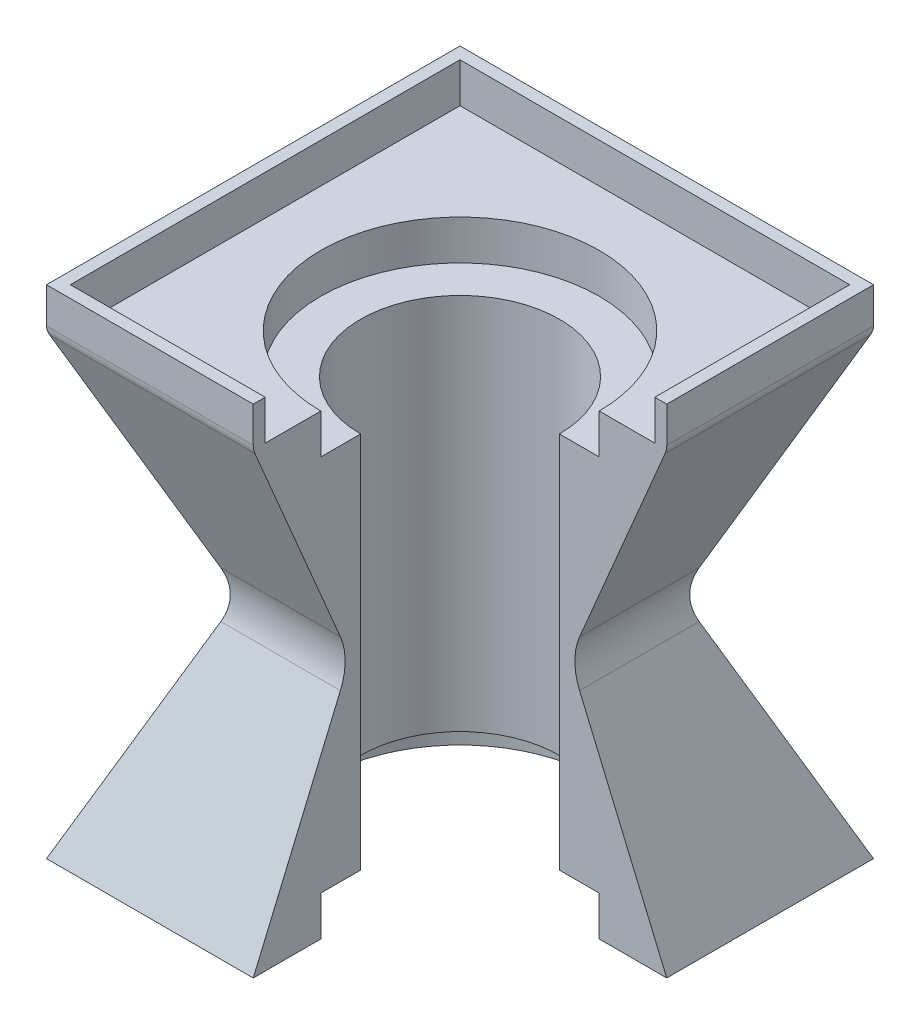
ISO-10303-21;
HEADER;
FILE_DESCRIPTION(('STEP AP214'),'2;1');
FILE_NAME('part.step','',(''),(''),'','','');
FILE_SCHEMA(('AUTOMOTIVE_DESIGN { 1 0 10303 214 1 1 1 1 }'));
ENDSEC;
DATA;
#1=APPLICATION_CONTEXT('core data for automotive mechanical design processes');
#2=APPLICATION_PROTOCOL_DEFINITION('international standard','automotive_design',2000,#1);
#3=PRODUCT_CONTEXT('',#1,'mechanical');
#4=PRODUCT('Part','Part','',(#3));
#5=PRODUCT_RELATED_PRODUCT_CATEGORY('part','',(#4));
#6=PRODUCT_DEFINITION_FORMATION('','',#4);
#7=PRODUCT_DEFINITION_CONTEXT('part definition',#1,'design');
#8=PRODUCT_DEFINITION('design','',#6,#7);
#9=PRODUCT_DEFINITION_SHAPE('','',#8);
#10=(LENGTH_UNIT() NAMED_UNIT(*) SI_UNIT(.MILLI.,.METRE.));
#11=(NAMED_UNIT(*) PLANE_ANGLE_UNIT() SI_UNIT($,.RADIAN.));
#12=(NAMED_UNIT(*) SI_UNIT($,.STERADIAN.) SOLID_ANGLE_UNIT());
#13=UNCERTAINTY_MEASURE_WITH_UNIT(LENGTH_MEASURE(1.E-05),#10,'distance_accuracy_value','');
#14=(GEOMETRIC_REPRESENTATION_CONTEXT(3) GLOBAL_UNCERTAINTY_ASSIGNED_CONTEXT((#13)) GLOBAL_UNIT_ASSIGNED_CONTEXT((#10,
#11,#12)) REPRESENTATION_CONTEXT('',''));
#15=CARTESIAN_POINT('',(0.,0.,0.));
#16=DIRECTION('',(0.,0.,1.));
#17=DIRECTION('',(1.,0.,0.));
#18=AXIS2_PLACEMENT_3D('',#15,#16,#17);
#19=CARTESIAN_POINT('',(0.,115.,0.));
#20=DIRECTION('',(0.,-1.,0.));
#21=DIRECTION('',(0.,0.,1.));
#22=AXIS2_PLACEMENT_3D('',#19,#20,#21);
#23=PLANE('',#22);
#24=DIRECTION('',(0.,0.,1.));
#25=VECTOR('',#24,1.);
#26=CARTESIAN_POINT('',(49.,115.,-3.));
#27=LINE('',#26,#25);
#28=CARTESIAN_POINT('',(49.,115.,-49.));
#29=VERTEX_POINT('',#28);
#30=CARTESIAN_POINT('',(49.,115.,0.));
#31=VERTEX_POINT('',#30);
#32=EDGE_CURVE('E234',#29,#31,#27,.T.);
#33=ORIENTED_EDGE('',*,*,#32,.F.);
#34=DIRECTION('',(1.,0.,0.));
#35=VECTOR('',#34,1.);
#36=CARTESIAN_POINT('',(49.,115.,-49.));
#37=LINE('',#36,#35);
#38=CARTESIAN_POINT('',(-49.,115.,-49.));
#39=VERTEX_POINT('',#38);
#40=EDGE_CURVE('E401',#39,#29,#37,.T.);
#41=ORIENTED_EDGE('',*,*,#40,.F.);
#42=DIRECTION('',(0.,0.,-1.));
#43=VECTOR('',#42,1.);
#44=CARTESIAN_POINT('',(-49.,115.,-49.));
#45=LINE('',#44,#43);
#46=CARTESIAN_POINT('',(-49.,115.,49.));
#47=VERTEX_POINT('',#46);
#48=EDGE_CURVE('E394',#47,#39,#45,.T.);
#49=ORIENTED_EDGE('',*,*,#48,.F.);
#50=DIRECTION('',(-1.,0.,0.));
#51=VECTOR('',#50,1.);
#52=CARTESIAN_POINT('',(-49.,115.,49.));
#53=LINE('',#52,#51);
#54=CARTESIAN_POINT('',(0.,115.,49.));
#55=VERTEX_POINT('',#54);
#56=EDGE_CURVE('E389',#55,#47,#53,.T.);
#57=ORIENTED_EDGE('',*,*,#56,.F.);
#58=DIRECTION('',(0.,0.,1.));
#59=VECTOR('',#58,1.);
#60=CARTESIAN_POINT('',(0.,115.,0.));
#61=LINE('',#60,#59);
#62=CARTESIAN_POINT('',(0.,115.,35.));
#63=VERTEX_POINT('',#62);
#64=EDGE_CURVE('E255',#63,#55,#61,.T.);
#65=ORIENTED_EDGE('',*,*,#64,.F.);
#66=CARTESIAN_POINT('',(0.,115.,0.));
#67=DIRECTION('',(0.,1.,0.));
#68=DIRECTION('',(0.,0.,1.));
#69=AXIS2_PLACEMENT_3D('',#66,#67,#68);
#70=CIRCLE('',#69,35.);
#71=CARTESIAN_POINT('',(35.,115.,0.));
#72=VERTEX_POINT('',#71);
#73=EDGE_CURVE('E299',#72,#63,#70,.T.);
#74=ORIENTED_EDGE('',*,*,#73,.F.);
#75=DIRECTION('',(-1.,0.,0.));
#76=VECTOR('',#75,1.);
#77=CARTESIAN_POINT('',(0.,115.,0.));
#78=LINE('',#77,#76);
#79=EDGE_CURVE('E251',#31,#72,#78,.T.);
#80=ORIENTED_EDGE('',*,*,#79,.F.);
#81=EDGE_LOOP('',(#33,#41,#49,#57,#65,#74,#80));
#82=FACE_BOUND('',#81,.T.);
#83=ADVANCED_FACE('F43',(#82),#23,.F.);
#84=CARTESIAN_POINT('',(0.,0.,0.));
#85=DIRECTION('',(0.,1.,0.));
#86=DIRECTION('',(0.,0.,1.));
#87=AXIS2_PLACEMENT_3D('',#84,#85,#86);
#88=CYLINDRICAL_SURFACE('',#87,25.);
#89=CARTESIAN_POINT('',(0.,105.,0.));
#90=DIRECTION('',(0.,1.,0.));
#91=DIRECTION('',(0.,0.,1.));
#92=AXIS2_PLACEMENT_3D('',#89,#90,#91);
#93=CIRCLE('',#92,25.);
#94=CARTESIAN_POINT('',(0.,105.,25.));
#95=VERTEX_POINT('',#94);
#96=CARTESIAN_POINT('',(25.,105.,0.));
#97=VERTEX_POINT('',#96);
#98=EDGE_CURVE('E298',#95,#97,#93,.F.);
#99=ORIENTED_EDGE('',*,*,#98,.F.);
#100=DIRECTION('',(0.,1.,0.));
#101=VECTOR('',#100,1.);
#102=CARTESIAN_POINT('',(0.,0.,25.));
#103=LINE('',#102,#101);
#104=CARTESIAN_POINT('',(0.,10.,25.));
#105=VERTEX_POINT('',#104);
#106=EDGE_CURVE('E275',#95,#105,#103,.F.);
#107=ORIENTED_EDGE('',*,*,#106,.T.);
#108=CARTESIAN_POINT('',(0.,10.,0.));
#109=DIRECTION('',(0.,-1.,0.));
#110=DIRECTION('',(0.,0.,-1.));
#111=AXIS2_PLACEMENT_3D('',#108,#109,#110);
#112=CIRCLE('',#111,25.);
#113=CARTESIAN_POINT('',(25.,10.,0.));
#114=VERTEX_POINT('',#113);
#115=EDGE_CURVE('E292',#114,#105,#112,.F.);
#116=ORIENTED_EDGE('',*,*,#115,.F.);
#117=DIRECTION('',(0.,1.,0.));
#118=VECTOR('',#117,1.);
#119=CARTESIAN_POINT('',(25.,0.,0.));
#120=LINE('',#119,#118);
#121=EDGE_CURVE('E261',#114,#97,#120,.T.);
#122=ORIENTED_EDGE('',*,*,#121,.T.);
#123=EDGE_LOOP('',(#99,#107,#116,#122));
#124=FACE_BOUND('',#123,.T.);
#125=ADVANCED_FACE('F448',(#124),#88,.F.);
#126=CARTESIAN_POINT('',(52.,0.,-52.));
#127=DIRECTION('',(0.92050485345244,0.390731128489275,0.));
#128=DIRECTION('',(-0.390731128489275,0.92050485345244,0.));
#129=AXIS2_PLACEMENT_3D('',#126,#127,#128);
#130=PLANE('',#129);
#131=DIRECTION('',(0.363936289648103,-0.8573801689766,-0.363936289648103));
#132=VECTOR('',#131,1.);
#133=CARTESIAN_POINT('',(38.2252392160259,32.4513027815816,-38.2252392160259));
#134=LINE('',#133,#132);
#135=CARTESIAN_POINT('',(30.0805309272405,51.6390330726609,-30.0805309272405));
#136=VERTEX_POINT('',#135);
#137=CARTESIAN_POINT('',(52.,0.,-52.));
#138=VERTEX_POINT('',#137);
#139=EDGE_CURVE('E324',#136,#138,#134,.T.);
#140=ORIENTED_EDGE('',*,*,#139,.F.);
#141=DIRECTION('',(0.,0.,1.));
#142=VECTOR('',#141,1.);
#143=CARTESIAN_POINT('',(30.0805309272405,51.6390330726609,0.));
#144=LINE('',#143,#142);
#145=CARTESIAN_POINT('',(30.0805309272405,51.6390330726609,0.));
#146=VERTEX_POINT('',#145);
#147=EDGE_CURVE('E342',#136,#146,#144,.T.);
#148=ORIENTED_EDGE('',*,*,#147,.T.);
#149=DIRECTION('',(-0.390731128489275,0.92050485345244,0.));
#150=VECTOR('',#149,1.);
#151=CARTESIAN_POINT('',(52.,0.,0.));
#152=LINE('',#151,#150);
#153=CARTESIAN_POINT('',(52.,0.,0.));
#154=VERTEX_POINT('',#153);
#155=EDGE_CURVE('E271',#146,#154,#152,.F.);
#156=ORIENTED_EDGE('',*,*,#155,.T.);
#157=DIRECTION('',(0.,0.,-1.));
#158=VECTOR('',#157,1.);
#159=CARTESIAN_POINT('',(52.,0.,-52.));
#160=LINE('',#159,#158);
#161=EDGE_CURVE('E305',#154,#138,#160,.T.);
#162=ORIENTED_EDGE('',*,*,#161,.T.);
#163=EDGE_LOOP('',(#140,#148,#156,#162));
#164=FACE_BOUND('',#163,.T.);
#165=ADVANCED_FACE('F467',(#164),#130,.T.);
#166=CARTESIAN_POINT('',(-52.,0.,-52.));
#167=DIRECTION('',(0.,0.390731128489275,-0.92050485345244));
#168=DIRECTION('',(0.,0.92050485345244,0.390731128489275));
#169=AXIS2_PLACEMENT_3D('',#166,#167,#168);
#170=PLANE('',#169);
#171=DIRECTION('',(-0.363936289648103,-0.8573801689766,-0.363936289648103));
#172=VECTOR('',#171,1.);
#173=CARTESIAN_POINT('',(-52.,0.,-52.));
#174=LINE('',#173,#172);
#175=CARTESIAN_POINT('',(-30.0805309272405,51.6390330726609,-30.0805309272405));
#176=VERTEX_POINT('',#175);
#177=CARTESIAN_POINT('',(-52.,0.,-52.));
#178=VERTEX_POINT('',#177);
#179=EDGE_CURVE('E327',#176,#178,#174,.T.);
#180=ORIENTED_EDGE('',*,*,#179,.F.);
#181=DIRECTION('',(1.,0.,0.));
#182=VECTOR('',#181,1.);
#183=CARTESIAN_POINT('',(27.5926980679477,51.6390330726609,-30.0805309272405));
#184=LINE('',#183,#182);
#185=EDGE_CURVE('E346',#176,#136,#184,.T.);
#186=ORIENTED_EDGE('',*,*,#185,.T.);
#187=ORIENTED_EDGE('',*,*,#139,.T.);
#188=DIRECTION('',(-1.,0.,0.));
#189=VECTOR('',#188,1.);
#190=CARTESIAN_POINT('',(-52.,0.,-52.));
#191=LINE('',#190,#189);
#192=EDGE_CURVE('E314',#138,#178,#191,.T.);
#193=ORIENTED_EDGE('',*,*,#192,.T.);
#194=EDGE_LOOP('',(#180,#186,#187,#193));
#195=FACE_BOUND('',#194,.T.);
#196=ADVANCED_FACE('F554',(#195),#170,.T.);
#197=CARTESIAN_POINT('',(-52.,0.,-52.));
#198=DIRECTION('',(-0.92050485345244,0.390731128489275,0.));
#199=DIRECTION('',(-0.390731128489275,-0.92050485345244,0.));
#200=AXIS2_PLACEMENT_3D('',#197,#198,#199);
#201=PLANE('',#200);
#202=DIRECTION('',(-0.363936289648103,-0.8573801689766,0.363936289648103));
#203=VECTOR('',#202,1.);
#204=CARTESIAN_POINT('',(-52.,0.,52.));
#205=LINE('',#204,#203);
#206=CARTESIAN_POINT('',(-30.0805309272405,51.6390330726609,30.0805309272405));
#207=VERTEX_POINT('',#206);
#208=CARTESIAN_POINT('',(-52.,0.,52.));
#209=VERTEX_POINT('',#208);
#210=EDGE_CURVE('E323',#207,#209,#205,.T.);
#211=ORIENTED_EDGE('',*,*,#210,.F.);
#212=DIRECTION('',(0.,0.,-1.));
#213=VECTOR('',#212,1.);
#214=CARTESIAN_POINT('',(-30.0805309272405,51.6390330726609,-27.5926980679476));
#215=LINE('',#214,#213);
#216=EDGE_CURVE('E350',#207,#176,#215,.T.);
#217=ORIENTED_EDGE('',*,*,#216,.T.);
#218=ORIENTED_EDGE('',*,*,#179,.T.);
#219=DIRECTION('',(0.,0.,1.));
#220=VECTOR('',#219,1.);
#221=CARTESIAN_POINT('',(-52.,0.,-52.));
#222=LINE('',#221,#220);
#223=EDGE_CURVE('E317',#178,#209,#222,.T.);
#224=ORIENTED_EDGE('',*,*,#223,.T.);
#225=EDGE_LOOP('',(#211,#217,#218,#224));
#226=FACE_BOUND('',#225,.T.);
#227=ADVANCED_FACE('F557',(#226),#201,.T.);
#228=CARTESIAN_POINT('',(-52.,0.,52.));
#229=DIRECTION('',(0.,0.390731128489275,0.92050485345244));
#230=DIRECTION('',(0.,-0.92050485345244,0.390731128489275));
#231=AXIS2_PLACEMENT_3D('',#228,#229,#230);
#232=PLANE('',#231);
#233=DIRECTION('',(0.,-0.92050485345244,0.390731128489275));
#234=VECTOR('',#233,1.);
#235=CARTESIAN_POINT('',(0.,0.,52.));
#236=LINE('',#235,#234);
#237=CARTESIAN_POINT('',(0.,0.,52.));
#238=VERTEX_POINT('',#237);
#239=CARTESIAN_POINT('',(0.,51.6390330726609,30.0805309272405));
#240=VERTEX_POINT('',#239);
#241=EDGE_CURVE('E285',#238,#240,#236,.F.);
#242=ORIENTED_EDGE('',*,*,#241,.T.);
#243=DIRECTION('',(-1.,0.,0.));
#244=VECTOR('',#243,1.);
#245=CARTESIAN_POINT('',(-27.5926980679477,51.6390330726609,30.0805309272405));
#246=LINE('',#245,#244);
#247=EDGE_CURVE('E354',#240,#207,#246,.T.);
#248=ORIENTED_EDGE('',*,*,#247,.T.);
#249=ORIENTED_EDGE('',*,*,#210,.T.);
#250=DIRECTION('',(1.,0.,0.));
#251=VECTOR('',#250,1.);
#252=CARTESIAN_POINT('',(-52.,0.,52.));
#253=LINE('',#252,#251);
#254=EDGE_CURVE('E320',#209,#238,#253,.T.);
#255=ORIENTED_EDGE('',*,*,#254,.T.);
#256=EDGE_LOOP('',(#242,#248,#249,#255));
#257=FACE_BOUND('',#256,.T.);
#258=ADVANCED_FACE('F551',(#257),#232,.T.);
#259=CARTESIAN_POINT('',(0.,0.,0.));
#260=DIRECTION('',(0.,1.,0.));
#261=DIRECTION('',(0.,0.,1.));
#262=AXIS2_PLACEMENT_3D('',#259,#260,#261);
#263=PLANE('',#262);
#264=CARTESIAN_POINT('',(0.,0.,0.));
#265=DIRECTION('',(0.,-1.,0.));
#266=DIRECTION('',(0.,0.,-1.));
#267=AXIS2_PLACEMENT_3D('',#264,#265,#266);
#268=CIRCLE('',#267,35.);
#269=CARTESIAN_POINT('',(0.,0.,35.));
#270=VERTEX_POINT('',#269);
#271=CARTESIAN_POINT('',(35.,0.,0.));
#272=VERTEX_POINT('',#271);
#273=EDGE_CURVE('E288',#270,#272,#268,.T.);
#274=ORIENTED_EDGE('',*,*,#273,.F.);
#275=DIRECTION('',(0.,0.,1.));
#276=VECTOR('',#275,1.);
#277=CARTESIAN_POINT('',(0.,0.,0.));
#278=LINE('',#277,#276);
#279=EDGE_CURVE('E247',#270,#238,#278,.T.);
#280=ORIENTED_EDGE('',*,*,#279,.T.);
#281=ORIENTED_EDGE('',*,*,#254,.F.);
#282=ORIENTED_EDGE('',*,*,#223,.F.);
#283=ORIENTED_EDGE('',*,*,#192,.F.);
#284=ORIENTED_EDGE('',*,*,#161,.F.);
#285=DIRECTION('',(-1.,0.,0.));
#286=VECTOR('',#285,1.);
#287=CARTESIAN_POINT('',(0.,0.,0.));
#288=LINE('',#287,#286);
#289=EDGE_CURVE('E250',#154,#272,#288,.T.);
#290=ORIENTED_EDGE('',*,*,#289,.T.);
#291=EDGE_LOOP('',(#274,#280,#281,#282,#283,#284,#290));
#292=FACE_BOUND('',#291,.T.);
#293=ADVANCED_FACE('F462',(#292),#263,.F.);
#294=CARTESIAN_POINT('',(52.,115.,-52.));
#295=DIRECTION('',(0.92050485345244,-0.390731128489275,0.));
#296=DIRECTION('',(-0.390731128489275,-0.92050485345244,0.));
#297=AXIS2_PLACEMENT_3D('',#294,#295,#296);
#298=PLANE('',#297);
#299=DIRECTION('',(0.363936289648103,0.8573801689766,-0.363936289648103));
#300=VECTOR('',#299,1.);
#301=CARTESIAN_POINT('',(38.2252392160259,82.5486972184184,-38.2252392160259));
#302=LINE('',#301,#300);
#303=CARTESIAN_POINT('',(30.0805309272405,63.3609669273391,-30.0805309272405));
#304=VERTEX_POINT('',#303);
#305=CARTESIAN_POINT('',(51.6025242672622,114.063605854672,-51.6025242672622));
#306=VERTEX_POINT('',#305);
#307=EDGE_CURVE('E302',#304,#306,#302,.T.);
#308=ORIENTED_EDGE('',*,*,#307,.T.);
#309=DIRECTION('',(0.,0.,-1.));
#310=VECTOR('',#309,1.);
#311=CARTESIAN_POINT('',(51.6025242672622,114.063605854672,-52.));
#312=LINE('',#311,#310);
#313=CARTESIAN_POINT('',(51.6025242672622,114.063605854672,0.));
#314=VERTEX_POINT('',#313);
#315=EDGE_CURVE('E368',#306,#314,#312,.F.);
#316=ORIENTED_EDGE('',*,*,#315,.T.);
#317=DIRECTION('',(0.390731128489275,0.92050485345244,0.));
#318=VECTOR('',#317,1.);
#319=CARTESIAN_POINT('',(52.,115.,0.));
#320=LINE('',#319,#318);
#321=CARTESIAN_POINT('',(30.0805309272405,63.3609669273391,0.));
#322=VERTEX_POINT('',#321);
#323=EDGE_CURVE('E269',#314,#322,#320,.F.);
#324=ORIENTED_EDGE('',*,*,#323,.T.);
#325=DIRECTION('',(0.,0.,1.));
#326=VECTOR('',#325,1.);
#327=CARTESIAN_POINT('',(30.0805309272405,63.3609669273391,-27.5926980679476));
#328=LINE('',#327,#326);
#329=EDGE_CURVE('E339',#322,#304,#328,.F.);
#330=ORIENTED_EDGE('',*,*,#329,.T.);
#331=EDGE_LOOP('',(#308,#316,#324,#330));
#332=FACE_BOUND('',#331,.T.);
#333=ADVANCED_FACE('F477',(#332),#298,.T.);
#334=CARTESIAN_POINT('',(-52.,115.,-52.));
#335=DIRECTION('',(0.,-0.390731128489275,-0.92050485345244));
#336=DIRECTION('',(0.,-0.92050485345244,0.390731128489275));
#337=AXIS2_PLACEMENT_3D('',#334,#335,#336);
#338=PLANE('',#337);
#339=DIRECTION('',(-0.363936289648103,0.8573801689766,-0.363936289648103));
#340=VECTOR('',#339,1.);
#341=CARTESIAN_POINT('',(-52.,115.,-52.));
#342=LINE('',#341,#340);
#343=CARTESIAN_POINT('',(-30.0805309272405,63.3609669273391,-30.0805309272405));
#344=VERTEX_POINT('',#343);
#345=CARTESIAN_POINT('',(-51.6025242672622,114.063605854672,-51.6025242672622));
#346=VERTEX_POINT('',#345);
#347=EDGE_CURVE('E306',#344,#346,#342,.T.);
#348=ORIENTED_EDGE('',*,*,#347,.T.);
#349=DIRECTION('',(-1.,0.,0.));
#350=VECTOR('',#349,1.);
#351=CARTESIAN_POINT('',(-52.,114.063605854672,-51.6025242672622));
#352=LINE('',#351,#350);
#353=EDGE_CURVE('E374',#346,#306,#352,.F.);
#354=ORIENTED_EDGE('',*,*,#353,.T.);
#355=ORIENTED_EDGE('',*,*,#307,.F.);
#356=DIRECTION('',(1.,0.,0.));
#357=VECTOR('',#356,1.);
#358=CARTESIAN_POINT('',(-27.5926980679477,63.3609669273391,-30.0805309272405));
#359=LINE('',#358,#357);
#360=EDGE_CURVE('E344',#304,#344,#359,.F.);
#361=ORIENTED_EDGE('',*,*,#360,.T.);
#362=EDGE_LOOP('',(#348,#354,#355,#361));
#363=FACE_BOUND('',#362,.T.);
#364=ADVANCED_FACE('F480',(#363),#338,.T.);
#365=CARTESIAN_POINT('',(-52.,115.,-52.));
#366=DIRECTION('',(-0.92050485345244,-0.390731128489275,0.));
#367=DIRECTION('',(-0.390731128489275,0.92050485345244,0.));
#368=AXIS2_PLACEMENT_3D('',#365,#366,#367);
#369=PLANE('',#368);
#370=DIRECTION('',(-0.363936289648103,0.8573801689766,0.363936289648103));
#371=VECTOR('',#370,1.);
#372=CARTESIAN_POINT('',(-52.,115.,52.));
#373=LINE('',#372,#371);
#374=CARTESIAN_POINT('',(-30.0805309272405,63.3609669273391,30.0805309272405));
#375=VERTEX_POINT('',#374);
#376=CARTESIAN_POINT('',(-51.6025242672622,114.063605854672,51.6025242672622));
#377=VERTEX_POINT('',#376);
#378=EDGE_CURVE('E307',#375,#377,#373,.T.);
#379=ORIENTED_EDGE('',*,*,#378,.T.);
#380=DIRECTION('',(0.,0.,1.));
#381=VECTOR('',#380,1.);
#382=CARTESIAN_POINT('',(-51.6025242672622,114.063605854672,-52.));
#383=LINE('',#382,#381);
#384=EDGE_CURVE('E377',#377,#346,#383,.F.);
#385=ORIENTED_EDGE('',*,*,#384,.T.);
#386=ORIENTED_EDGE('',*,*,#347,.F.);
#387=DIRECTION('',(0.,0.,-1.));
#388=VECTOR('',#387,1.);
#389=CARTESIAN_POINT('',(-30.0805309272405,63.3609669273391,27.5926980679477));
#390=LINE('',#389,#388);
#391=EDGE_CURVE('E348',#344,#375,#390,.F.);
#392=ORIENTED_EDGE('',*,*,#391,.T.);
#393=EDGE_LOOP('',(#379,#385,#386,#392));
#394=FACE_BOUND('',#393,.T.);
#395=ADVANCED_FACE('F542',(#394),#369,.T.);
#396=CARTESIAN_POINT('',(-52.,115.,52.));
#397=DIRECTION('',(0.,-0.390731128489275,0.92050485345244));
#398=DIRECTION('',(0.,0.92050485345244,0.390731128489275));
#399=AXIS2_PLACEMENT_3D('',#396,#397,#398);
#400=PLANE('',#399);
#401=DIRECTION('',(0.,-0.92050485345244,-0.390731128489275));
#402=VECTOR('',#401,1.);
#403=CARTESIAN_POINT('',(0.,115.,52.));
#404=LINE('',#403,#402);
#405=CARTESIAN_POINT('',(0.,63.3609669273391,30.0805309272405));
#406=VERTEX_POINT('',#405);
#407=CARTESIAN_POINT('',(0.,114.063605854672,51.6025242672622));
#408=VERTEX_POINT('',#407);
#409=EDGE_CURVE('E283',#406,#408,#404,.F.);
#410=ORIENTED_EDGE('',*,*,#409,.T.);
#411=DIRECTION('',(1.,0.,0.));
#412=VECTOR('',#411,1.);
#413=CARTESIAN_POINT('',(-52.,114.063605854672,51.6025242672622));
#414=LINE('',#413,#412);
#415=EDGE_CURVE('E11',#408,#377,#414,.F.);
#416=ORIENTED_EDGE('',*,*,#415,.T.);
#417=ORIENTED_EDGE('',*,*,#378,.F.);
#418=DIRECTION('',(-1.,0.,0.));
#419=VECTOR('',#418,1.);
#420=CARTESIAN_POINT('',(0.,63.3609669273391,30.0805309272405));
#421=LINE('',#420,#419);
#422=EDGE_CURVE('E352',#375,#406,#421,.F.);
#423=ORIENTED_EDGE('',*,*,#422,.T.);
#424=EDGE_LOOP('',(#410,#416,#417,#423));
#425=FACE_BOUND('',#424,.T.);
#426=ADVANCED_FACE('F539',(#425),#400,.T.);
#427=CARTESIAN_POINT('',(0.,105.,0.));
#428=DIRECTION('',(0.,1.,0.));
#429=DIRECTION('',(0.,0.,1.));
#430=AXIS2_PLACEMENT_3D('',#427,#428,#429);
#431=PLANE('',#430);
#432=DIRECTION('',(0.,0.,1.));
#433=VECTOR('',#432,1.);
#434=CARTESIAN_POINT('',(0.,105.,0.));
#435=LINE('',#434,#433);
#436=CARTESIAN_POINT('',(0.,105.,35.));
#437=VERTEX_POINT('',#436);
#438=EDGE_CURVE('E278',#95,#437,#435,.T.);
#439=ORIENTED_EDGE('',*,*,#438,.F.);
#440=ORIENTED_EDGE('',*,*,#98,.T.);
#441=DIRECTION('',(-1.,0.,0.));
#442=VECTOR('',#441,1.);
#443=CARTESIAN_POINT('',(0.,105.,0.));
#444=LINE('',#443,#442);
#445=CARTESIAN_POINT('',(35.,105.,0.));
#446=VERTEX_POINT('',#445);
#447=EDGE_CURVE('E264',#446,#97,#444,.T.);
#448=ORIENTED_EDGE('',*,*,#447,.F.);
#449=CARTESIAN_POINT('',(0.,105.,0.));
#450=DIRECTION('',(0.,1.,0.));
#451=DIRECTION('',(0.,0.,1.));
#452=AXIS2_PLACEMENT_3D('',#449,#450,#451);
#453=CIRCLE('',#452,35.);
#454=EDGE_CURVE('E295',#446,#437,#453,.T.);
#455=ORIENTED_EDGE('',*,*,#454,.T.);
#456=EDGE_LOOP('',(#439,#440,#448,#455));
#457=FACE_BOUND('',#456,.T.);
#458=ADVANCED_FACE('F445',(#457),#431,.T.);
#459=CARTESIAN_POINT('',(0.,105.,0.));
#460=DIRECTION('',(0.,1.,0.));
#461=DIRECTION('',(0.,0.,1.));
#462=AXIS2_PLACEMENT_3D('',#459,#460,#461);
#463=CYLINDRICAL_SURFACE('',#462,35.);
#464=ORIENTED_EDGE('',*,*,#73,.T.);
#465=DIRECTION('',(0.,1.,0.));
#466=VECTOR('',#465,1.);
#467=CARTESIAN_POINT('',(0.,105.,35.));
#468=LINE('',#467,#466);
#469=EDGE_CURVE('E280',#63,#437,#468,.F.);
#470=ORIENTED_EDGE('',*,*,#469,.T.);
#471=ORIENTED_EDGE('',*,*,#454,.F.);
#472=DIRECTION('',(0.,1.,0.));
#473=VECTOR('',#472,1.);
#474=CARTESIAN_POINT('',(35.,105.,0.));
#475=LINE('',#474,#473);
#476=EDGE_CURVE('E266',#446,#72,#475,.T.);
#477=ORIENTED_EDGE('',*,*,#476,.T.);
#478=EDGE_LOOP('',(#464,#470,#471,#477));
#479=FACE_BOUND('',#478,.T.);
#480=ADVANCED_FACE('F437',(#479),#463,.F.);
#481=CARTESIAN_POINT('',(0.,10.,0.));
#482=DIRECTION('',(0.,-1.,0.));
#483=DIRECTION('',(0.,0.,-1.));
#484=AXIS2_PLACEMENT_3D('',#481,#482,#483);
#485=PLANE('',#484);
#486=DIRECTION('',(0.,0.,-1.));
#487=VECTOR('',#486,1.);
#488=CARTESIAN_POINT('',(0.,10.,0.));
#489=LINE('',#488,#487);
#490=CARTESIAN_POINT('',(0.,10.,35.));
#491=VERTEX_POINT('',#490);
#492=EDGE_CURVE('E273',#491,#105,#489,.T.);
#493=ORIENTED_EDGE('',*,*,#492,.F.);
#494=CARTESIAN_POINT('',(0.,10.,0.));
#495=DIRECTION('',(0.,-1.,0.));
#496=DIRECTION('',(0.,0.,-1.));
#497=AXIS2_PLACEMENT_3D('',#494,#495,#496);
#498=CIRCLE('',#497,35.);
#499=CARTESIAN_POINT('',(35.,10.,0.));
#500=VERTEX_POINT('',#499);
#501=EDGE_CURVE('E289',#491,#500,#498,.T.);
#502=ORIENTED_EDGE('',*,*,#501,.T.);
#503=DIRECTION('',(1.,0.,0.));
#504=VECTOR('',#503,1.);
#505=CARTESIAN_POINT('',(0.,10.,0.));
#506=LINE('',#505,#504);
#507=EDGE_CURVE('E254',#114,#500,#506,.T.);
#508=ORIENTED_EDGE('',*,*,#507,.F.);
#509=ORIENTED_EDGE('',*,*,#115,.T.);
#510=EDGE_LOOP('',(#493,#502,#508,#509));
#511=FACE_BOUND('',#510,.T.);
#512=ADVANCED_FACE('F453',(#511),#485,.T.);
#513=CARTESIAN_POINT('',(0.,10.,0.));
#514=DIRECTION('',(0.,-1.,0.));
#515=DIRECTION('',(0.,0.,-1.));
#516=AXIS2_PLACEMENT_3D('',#513,#514,#515);
#517=CYLINDRICAL_SURFACE('',#516,35.);
#518=ORIENTED_EDGE('',*,*,#501,.F.);
#519=DIRECTION('',(0.,-1.,0.));
#520=VECTOR('',#519,1.);
#521=CARTESIAN_POINT('',(0.,10.,35.));
#522=LINE('',#521,#520);
#523=EDGE_CURVE('E336',#491,#270,#522,.T.);
#524=ORIENTED_EDGE('',*,*,#523,.T.);
#525=ORIENTED_EDGE('',*,*,#273,.T.);
#526=DIRECTION('',(0.,-1.,0.));
#527=VECTOR('',#526,1.);
#528=CARTESIAN_POINT('',(35.,10.,0.));
#529=LINE('',#528,#527);
#530=EDGE_CURVE('E326',#272,#500,#529,.F.);
#531=ORIENTED_EDGE('',*,*,#530,.T.);
#532=EDGE_LOOP('',(#518,#524,#525,#531));
#533=FACE_BOUND('',#532,.T.);
#534=ADVANCED_FACE('F456',(#533),#517,.F.);
#535=CARTESIAN_POINT('',(0.,0.,0.));
#536=DIRECTION('',(0.,0.,-1.));
#537=DIRECTION('',(-1.,0.,0.));
#538=AXIS2_PLACEMENT_3D('',#535,#536,#537);
#539=PLANE('',#538);
#540=ORIENTED_EDGE('',*,*,#323,.F.);
#541=CARTESIAN_POINT('',(47.,116.017261497119,0.));
#542=DIRECTION('',(0.,0.,-1.));
#543=DIRECTION('',(-1.,0.,0.));
#544=AXIS2_PLACEMENT_3D('',#541,#542,#543);
#545=CIRCLE('',#544,5.);
#546=CARTESIAN_POINT('',(52.,116.017261497119,0.));
#547=VERTEX_POINT('',#546);
#548=EDGE_CURVE('E370',#314,#547,#545,.F.);
#549=ORIENTED_EDGE('',*,*,#548,.T.);
#550=DIRECTION('',(0.,-1.,0.));
#551=VECTOR('',#550,1.);
#552=CARTESIAN_POINT('',(52.,125.,0.));
#553=LINE('',#552,#551);
#554=CARTESIAN_POINT('',(52.,125.,0.));
#555=VERTEX_POINT('',#554);
#556=EDGE_CURVE('E415',#555,#547,#553,.T.);
#557=ORIENTED_EDGE('',*,*,#556,.F.);
#558=DIRECTION('',(1.,0.,0.));
#559=VECTOR('',#558,1.);
#560=CARTESIAN_POINT('',(49.,125.,0.));
#561=LINE('',#560,#559);
#562=CARTESIAN_POINT('',(49.,125.,0.));
#563=VERTEX_POINT('',#562);
#564=EDGE_CURVE('E495',#563,#555,#561,.T.);
#565=ORIENTED_EDGE('',*,*,#564,.F.);
#566=DIRECTION('',(0.,-1.,0.));
#567=VECTOR('',#566,1.);
#568=CARTESIAN_POINT('',(49.,125.,0.));
#569=LINE('',#568,#567);
#570=EDGE_CURVE('E418',#563,#31,#569,.T.);
#571=ORIENTED_EDGE('',*,*,#570,.T.);
#572=ORIENTED_EDGE('',*,*,#79,.T.);
#573=ORIENTED_EDGE('',*,*,#476,.F.);
#574=ORIENTED_EDGE('',*,*,#447,.T.);
#575=ORIENTED_EDGE('',*,*,#121,.F.);
#576=ORIENTED_EDGE('',*,*,#507,.T.);
#577=ORIENTED_EDGE('',*,*,#530,.F.);
#578=ORIENTED_EDGE('',*,*,#289,.F.);
#579=ORIENTED_EDGE('',*,*,#155,.F.);
#580=CARTESIAN_POINT('',(43.8881037290271,57.5,0.));
#581=DIRECTION('',(0.,0.,-1.));
#582=DIRECTION('',(-1.,0.,0.));
#583=AXIS2_PLACEMENT_3D('',#580,#581,#582);
#584=CIRCLE('',#583,15.);
#585=EDGE_CURVE('E356',#146,#322,#584,.T.);
#586=ORIENTED_EDGE('',*,*,#585,.T.);
#587=EDGE_LOOP('',(#540,#549,#557,#565,#571,#572,#573,#574,#575,#576,#577,#578,#579,#586));
#588=FACE_BOUND('',#587,.T.);
#589=ADVANCED_FACE('F442',(#588),#539,.F.);
#590=CARTESIAN_POINT('',(0.,0.,0.));
#591=DIRECTION('',(-1.,0.,0.));
#592=DIRECTION('',(0.,0.,1.));
#593=AXIS2_PLACEMENT_3D('',#590,#591,#592);
#594=PLANE('',#593);
#595=DIRECTION('',(0.,-1.,0.));
#596=VECTOR('',#595,1.);
#597=CARTESIAN_POINT('',(0.,125.,52.));
#598=LINE('',#597,#596);
#599=CARTESIAN_POINT('',(0.,125.,52.));
#600=VERTEX_POINT('',#599);
#601=CARTESIAN_POINT('',(0.,116.017261497119,52.));
#602=VERTEX_POINT('',#601);
#603=EDGE_CURVE('E221',#600,#602,#598,.T.);
#604=ORIENTED_EDGE('',*,*,#603,.T.);
#605=CARTESIAN_POINT('',(0.,116.017261497119,47.));
#606=DIRECTION('',(-1.,0.,0.));
#607=DIRECTION('',(0.,0.,1.));
#608=AXIS2_PLACEMENT_3D('',#605,#606,#607);
#609=CIRCLE('',#608,5.);
#610=EDGE_CURVE('E52',#602,#408,#609,.F.);
#611=ORIENTED_EDGE('',*,*,#610,.T.);
#612=ORIENTED_EDGE('',*,*,#409,.F.);
#613=CARTESIAN_POINT('',(0.,57.5,43.8881037290271));
#614=DIRECTION('',(-1.,0.,0.));
#615=DIRECTION('',(0.,0.,1.));
#616=AXIS2_PLACEMENT_3D('',#613,#614,#615);
#617=CIRCLE('',#616,15.);
#618=EDGE_CURVE('E359',#406,#240,#617,.T.);
#619=ORIENTED_EDGE('',*,*,#618,.T.);
#620=ORIENTED_EDGE('',*,*,#241,.F.);
#621=ORIENTED_EDGE('',*,*,#279,.F.);
#622=ORIENTED_EDGE('',*,*,#523,.F.);
#623=ORIENTED_EDGE('',*,*,#492,.T.);
#624=ORIENTED_EDGE('',*,*,#106,.F.);
#625=ORIENTED_EDGE('',*,*,#438,.T.);
#626=ORIENTED_EDGE('',*,*,#469,.F.);
#627=ORIENTED_EDGE('',*,*,#64,.T.);
#628=DIRECTION('',(0.,-1.,0.));
#629=VECTOR('',#628,1.);
#630=CARTESIAN_POINT('',(0.,125.,49.));
#631=LINE('',#630,#629);
#632=CARTESIAN_POINT('',(0.,125.,49.));
#633=VERTEX_POINT('',#632);
#634=EDGE_CURVE('E243',#633,#55,#631,.T.);
#635=ORIENTED_EDGE('',*,*,#634,.F.);
#636=DIRECTION('',(0.,0.,-1.));
#637=VECTOR('',#636,1.);
#638=CARTESIAN_POINT('',(0.,125.,49.));
#639=LINE('',#638,#637);
#640=EDGE_CURVE('E224',#600,#633,#639,.T.);
#641=ORIENTED_EDGE('',*,*,#640,.F.);
#642=EDGE_LOOP('',(#604,#611,#612,#619,#620,#621,#622,#623,#624,#625,#626,#627,#635,#641));
#643=FACE_BOUND('',#642,.T.);
#644=ADVANCED_FACE('F432',(#643),#594,.F.);
#645=CARTESIAN_POINT('',(-52.,57.5,43.8881037290271));
#646=DIRECTION('',(-1.,0.,0.));
#647=DIRECTION('',(0.,0.,1.));
#648=AXIS2_PLACEMENT_3D('',#645,#646,#647);
#649=CYLINDRICAL_SURFACE('',#648,15.);
#650=ORIENTED_EDGE('',*,*,#618,.F.);
#651=ORIENTED_EDGE('',*,*,#422,.F.);
#652=CARTESIAN_POINT('',(-43.8881037290271,57.5,43.8881037290271));
#653=DIRECTION('',(-0.707106781186548,0.,-0.707106781186547));
#654=DIRECTION('',(-0.707106781186547,0.,0.707106781186548));
#655=AXIS2_PLACEMENT_3D('',#652,#653,#654);
#656=ELLIPSE('',#655,21.2132034355964,15.);
#657=EDGE_CURVE('E258',#207,#375,#656,.F.);
#658=ORIENTED_EDGE('',*,*,#657,.F.);
#659=ORIENTED_EDGE('',*,*,#247,.F.);
#660=EDGE_LOOP('',(#650,#651,#658,#659));
#661=FACE_BOUND('',#660,.T.);
#662=ADVANCED_FACE('F573',(#661),#649,.F.);
#663=CARTESIAN_POINT('',(-43.8881037290271,57.5,-52.));
#664=DIRECTION('',(0.,0.,-1.));
#665=DIRECTION('',(-1.,0.,0.));
#666=AXIS2_PLACEMENT_3D('',#663,#664,#665);
#667=CYLINDRICAL_SURFACE('',#666,15.);
#668=ORIENTED_EDGE('',*,*,#657,.T.);
#669=ORIENTED_EDGE('',*,*,#391,.F.);
#670=CARTESIAN_POINT('',(-43.8881037290271,57.5,-43.8881037290271));
#671=DIRECTION('',(0.707106781186547,0.,-0.707106781186548));
#672=DIRECTION('',(-0.707106781186548,0.,-0.707106781186547));
#673=AXIS2_PLACEMENT_3D('',#670,#671,#672);
#674=ELLIPSE('',#673,21.2132034355964,15.);
#675=EDGE_CURVE('E241',#176,#344,#674,.F.);
#676=ORIENTED_EDGE('',*,*,#675,.F.);
#677=ORIENTED_EDGE('',*,*,#216,.F.);
#678=EDGE_LOOP('',(#668,#669,#676,#677));
#679=FACE_BOUND('',#678,.T.);
#680=ADVANCED_FACE('F569',(#679),#667,.F.);
#681=CARTESIAN_POINT('',(-52.,57.5,-43.8881037290271));
#682=DIRECTION('',(1.,0.,0.));
#683=DIRECTION('',(0.,0.,-1.));
#684=AXIS2_PLACEMENT_3D('',#681,#682,#683);
#685=CYLINDRICAL_SURFACE('',#684,15.);
#686=ORIENTED_EDGE('',*,*,#675,.T.);
#687=ORIENTED_EDGE('',*,*,#360,.F.);
#688=CARTESIAN_POINT('',(43.8881037290271,57.5,-43.8881037290271));
#689=DIRECTION('',(0.707106781186548,0.,0.707106781186547));
#690=DIRECTION('',(0.707106781186547,0.,-0.707106781186548));
#691=AXIS2_PLACEMENT_3D('',#688,#689,#690);
#692=ELLIPSE('',#691,21.2132034355964,15.);
#693=EDGE_CURVE('E239',#136,#304,#692,.F.);
#694=ORIENTED_EDGE('',*,*,#693,.F.);
#695=ORIENTED_EDGE('',*,*,#185,.F.);
#696=EDGE_LOOP('',(#686,#687,#694,#695));
#697=FACE_BOUND('',#696,.T.);
#698=ADVANCED_FACE('F566',(#697),#685,.F.);
#699=CARTESIAN_POINT('',(43.8881037290271,57.5,-52.));
#700=DIRECTION('',(0.,0.,1.));
#701=DIRECTION('',(1.,0.,0.));
#702=AXIS2_PLACEMENT_3D('',#699,#700,#701);
#703=CYLINDRICAL_SURFACE('',#702,15.);
#704=ORIENTED_EDGE('',*,*,#585,.F.);
#705=ORIENTED_EDGE('',*,*,#147,.F.);
#706=ORIENTED_EDGE('',*,*,#693,.T.);
#707=ORIENTED_EDGE('',*,*,#329,.F.);
#708=EDGE_LOOP('',(#704,#705,#706,#707));
#709=FACE_BOUND('',#708,.T.);
#710=ADVANCED_FACE('F472',(#709),#703,.F.);
#711=CARTESIAN_POINT('',(-52.,125.,52.));
#712=DIRECTION('',(1.,0.,0.));
#713=DIRECTION('',(0.,0.,-1.));
#714=AXIS2_PLACEMENT_3D('',#711,#712,#713);
#715=PLANE('',#714);
#716=DIRECTION('',(0.,-1.,0.));
#717=VECTOR('',#716,1.);
#718=CARTESIAN_POINT('',(-52.,125.,-52.));
#719=LINE('',#718,#717);
#720=CARTESIAN_POINT('',(-52.,125.,-52.));
#721=VERTEX_POINT('',#720);
#722=CARTESIAN_POINT('',(-52.,116.017261497119,-52.));
#723=VERTEX_POINT('',#722);
#724=EDGE_CURVE('E410',#721,#723,#719,.T.);
#725=ORIENTED_EDGE('',*,*,#724,.T.);
#726=DIRECTION('',(0.,0.,-1.));
#727=VECTOR('',#726,1.);
#728=CARTESIAN_POINT('',(-52.,116.017261497119,52.));
#729=LINE('',#728,#727);
#730=CARTESIAN_POINT('',(-52.,116.017261497119,52.));
#731=VERTEX_POINT('',#730);
#732=EDGE_CURVE('E238',#723,#731,#729,.F.);
#733=ORIENTED_EDGE('',*,*,#732,.T.);
#734=DIRECTION('',(0.,-1.,0.));
#735=VECTOR('',#734,1.);
#736=CARTESIAN_POINT('',(-52.,125.,52.));
#737=LINE('',#736,#735);
#738=CARTESIAN_POINT('',(-52.,125.,52.));
#739=VERTEX_POINT('',#738);
#740=EDGE_CURVE('E220',#739,#731,#737,.T.);
#741=ORIENTED_EDGE('',*,*,#740,.F.);
#742=DIRECTION('',(0.,0.,1.));
#743=VECTOR('',#742,1.);
#744=CARTESIAN_POINT('',(-52.,125.,52.));
#745=LINE('',#744,#743);
#746=EDGE_CURVE('E225',#721,#739,#745,.T.);
#747=ORIENTED_EDGE('',*,*,#746,.F.);
#748=EDGE_LOOP('',(#725,#733,#741,#747));
#749=FACE_BOUND('',#748,.T.);
#750=ADVANCED_FACE('F236',(#749),#715,.F.);
#751=CARTESIAN_POINT('',(0.,125.,52.));
#752=DIRECTION('',(0.,0.,-1.));
#753=DIRECTION('',(-1.,0.,0.));
#754=AXIS2_PLACEMENT_3D('',#751,#752,#753);
#755=PLANE('',#754);
#756=ORIENTED_EDGE('',*,*,#740,.T.);
#757=DIRECTION('',(-1.,0.,0.));
#758=VECTOR('',#757,1.);
#759=CARTESIAN_POINT('',(0.,116.017261497119,52.));
#760=LINE('',#759,#758);
#761=EDGE_CURVE('E67',#731,#602,#760,.F.);
#762=ORIENTED_EDGE('',*,*,#761,.T.);
#763=ORIENTED_EDGE('',*,*,#603,.F.);
#764=DIRECTION('',(1.,0.,0.));
#765=VECTOR('',#764,1.);
#766=CARTESIAN_POINT('',(0.,125.,52.));
#767=LINE('',#766,#765);
#768=EDGE_CURVE('E216',#739,#600,#767,.T.);
#769=ORIENTED_EDGE('',*,*,#768,.F.);
#770=EDGE_LOOP('',(#756,#762,#763,#769));
#771=FACE_BOUND('',#770,.T.);
#772=ADVANCED_FACE('F218',(#771),#755,.F.);
#773=CARTESIAN_POINT('',(-49.,125.,49.));
#774=DIRECTION('',(0.,0.,1.));
#775=DIRECTION('',(1.,0.,0.));
#776=AXIS2_PLACEMENT_3D('',#773,#774,#775);
#777=PLANE('',#776);
#778=ORIENTED_EDGE('',*,*,#56,.T.);
#779=DIRECTION('',(0.,-1.,0.));
#780=VECTOR('',#779,1.);
#781=CARTESIAN_POINT('',(-49.,125.,49.));
#782=LINE('',#781,#780);
#783=CARTESIAN_POINT('',(-49.,125.,49.));
#784=VERTEX_POINT('',#783);
#785=EDGE_CURVE('E427',#784,#47,#782,.T.);
#786=ORIENTED_EDGE('',*,*,#785,.F.);
#787=DIRECTION('',(-1.,0.,0.));
#788=VECTOR('',#787,1.);
#789=CARTESIAN_POINT('',(-3.,125.,49.));
#790=LINE('',#789,#788);
#791=EDGE_CURVE('E431',#633,#784,#790,.T.);
#792=ORIENTED_EDGE('',*,*,#791,.F.);
#793=ORIENTED_EDGE('',*,*,#634,.T.);
#794=EDGE_LOOP('',(#778,#786,#792,#793));
#795=FACE_BOUND('',#794,.T.);
#796=ADVANCED_FACE('F430',(#795),#777,.F.);
#797=CARTESIAN_POINT('',(-49.,125.,-49.));
#798=DIRECTION('',(-1.,0.,0.));
#799=DIRECTION('',(0.,0.,1.));
#800=AXIS2_PLACEMENT_3D('',#797,#798,#799);
#801=PLANE('',#800);
#802=ORIENTED_EDGE('',*,*,#48,.T.);
#803=DIRECTION('',(0.,-1.,0.));
#804=VECTOR('',#803,1.);
#805=CARTESIAN_POINT('',(-49.,125.,-49.));
#806=LINE('',#805,#804);
#807=CARTESIAN_POINT('',(-49.,125.,-49.));
#808=VERTEX_POINT('',#807);
#809=EDGE_CURVE('E424',#808,#39,#806,.T.);
#810=ORIENTED_EDGE('',*,*,#809,.F.);
#811=DIRECTION('',(0.,0.,-1.));
#812=VECTOR('',#811,1.);
#813=CARTESIAN_POINT('',(-49.,125.,-49.));
#814=LINE('',#813,#812);
#815=EDGE_CURVE('E502',#784,#808,#814,.T.);
#816=ORIENTED_EDGE('',*,*,#815,.F.);
#817=ORIENTED_EDGE('',*,*,#785,.T.);
#818=EDGE_LOOP('',(#802,#810,#816,#817));
#819=FACE_BOUND('',#818,.T.);
#820=ADVANCED_FACE('F508',(#819),#801,.F.);
#821=CARTESIAN_POINT('',(49.,125.,-49.));
#822=DIRECTION('',(0.,0.,-1.));
#823=DIRECTION('',(-1.,0.,0.));
#824=AXIS2_PLACEMENT_3D('',#821,#822,#823);
#825=PLANE('',#824);
#826=ORIENTED_EDGE('',*,*,#40,.T.);
#827=DIRECTION('',(0.,-1.,0.));
#828=VECTOR('',#827,1.);
#829=CARTESIAN_POINT('',(49.,125.,-49.));
#830=LINE('',#829,#828);
#831=CARTESIAN_POINT('',(49.,125.,-49.));
#832=VERTEX_POINT('',#831);
#833=EDGE_CURVE('E421',#832,#29,#830,.T.);
#834=ORIENTED_EDGE('',*,*,#833,.F.);
#835=DIRECTION('',(1.,0.,0.));
#836=VECTOR('',#835,1.);
#837=CARTESIAN_POINT('',(49.,125.,-49.));
#838=LINE('',#837,#836);
#839=EDGE_CURVE('E500',#808,#832,#838,.T.);
#840=ORIENTED_EDGE('',*,*,#839,.F.);
#841=ORIENTED_EDGE('',*,*,#809,.T.);
#842=EDGE_LOOP('',(#826,#834,#840,#841));
#843=FACE_BOUND('',#842,.T.);
#844=ADVANCED_FACE('F512',(#843),#825,.F.);
#845=CARTESIAN_POINT('',(49.,125.,-3.));
#846=DIRECTION('',(1.,0.,0.));
#847=DIRECTION('',(0.,0.,-1.));
#848=AXIS2_PLACEMENT_3D('',#845,#846,#847);
#849=PLANE('',#848);
#850=ORIENTED_EDGE('',*,*,#32,.T.);
#851=ORIENTED_EDGE('',*,*,#570,.F.);
#852=DIRECTION('',(0.,0.,1.));
#853=VECTOR('',#852,1.);
#854=CARTESIAN_POINT('',(49.,125.,-3.));
#855=LINE('',#854,#853);
#856=EDGE_CURVE('E496',#832,#563,#855,.T.);
#857=ORIENTED_EDGE('',*,*,#856,.F.);
#858=ORIENTED_EDGE('',*,*,#833,.T.);
#859=EDGE_LOOP('',(#850,#851,#857,#858));
#860=FACE_BOUND('',#859,.T.);
#861=ADVANCED_FACE('F516',(#860),#849,.F.);
#862=CARTESIAN_POINT('',(52.,125.,-52.));
#863=DIRECTION('',(-1.,0.,0.));
#864=DIRECTION('',(0.,0.,1.));
#865=AXIS2_PLACEMENT_3D('',#862,#863,#864);
#866=PLANE('',#865);
#867=ORIENTED_EDGE('',*,*,#556,.T.);
#868=DIRECTION('',(0.,0.,1.));
#869=VECTOR('',#868,1.);
#870=CARTESIAN_POINT('',(52.,116.017261497119,-52.));
#871=LINE('',#870,#869);
#872=CARTESIAN_POINT('',(52.,116.017261497119,-52.));
#873=VERTEX_POINT('',#872);
#874=EDGE_CURVE('E360',#547,#873,#871,.F.);
#875=ORIENTED_EDGE('',*,*,#874,.T.);
#876=DIRECTION('',(0.,-1.,0.));
#877=VECTOR('',#876,1.);
#878=CARTESIAN_POINT('',(52.,125.,-52.));
#879=LINE('',#878,#877);
#880=CARTESIAN_POINT('',(52.,125.,-52.));
#881=VERTEX_POINT('',#880);
#882=EDGE_CURVE('E412',#881,#873,#879,.T.);
#883=ORIENTED_EDGE('',*,*,#882,.F.);
#884=DIRECTION('',(0.,0.,-1.));
#885=VECTOR('',#884,1.);
#886=CARTESIAN_POINT('',(52.,125.,-52.));
#887=LINE('',#886,#885);
#888=EDGE_CURVE('E494',#555,#881,#887,.T.);
#889=ORIENTED_EDGE('',*,*,#888,.F.);
#890=EDGE_LOOP('',(#867,#875,#883,#889));
#891=FACE_BOUND('',#890,.T.);
#892=ADVANCED_FACE('F492',(#891),#866,.F.);
#893=CARTESIAN_POINT('',(-52.,125.,-52.));
#894=DIRECTION('',(0.,0.,1.));
#895=DIRECTION('',(1.,0.,0.));
#896=AXIS2_PLACEMENT_3D('',#893,#894,#895);
#897=PLANE('',#896);
#898=ORIENTED_EDGE('',*,*,#882,.T.);
#899=DIRECTION('',(1.,0.,0.));
#900=VECTOR('',#899,1.);
#901=CARTESIAN_POINT('',(-52.,116.017261497119,-52.));
#902=LINE('',#901,#900);
#903=EDGE_CURVE('E372',#873,#723,#902,.F.);
#904=ORIENTED_EDGE('',*,*,#903,.T.);
#905=ORIENTED_EDGE('',*,*,#724,.F.);
#906=DIRECTION('',(-1.,0.,0.));
#907=VECTOR('',#906,1.);
#908=CARTESIAN_POINT('',(-52.,125.,-52.));
#909=LINE('',#908,#907);
#910=EDGE_CURVE('E230',#881,#721,#909,.T.);
#911=ORIENTED_EDGE('',*,*,#910,.F.);
#912=EDGE_LOOP('',(#898,#904,#905,#911));
#913=FACE_BOUND('',#912,.T.);
#914=ADVANCED_FACE('F524',(#913),#897,.F.);
#915=CARTESIAN_POINT('',(0.,125.,0.));
#916=DIRECTION('',(0.,-1.,0.));
#917=DIRECTION('',(0.,0.,-1.));
#918=AXIS2_PLACEMENT_3D('',#915,#916,#917);
#919=PLANE('',#918);
#920=ORIENTED_EDGE('',*,*,#746,.T.);
#921=ORIENTED_EDGE('',*,*,#768,.T.);
#922=ORIENTED_EDGE('',*,*,#640,.T.);
#923=ORIENTED_EDGE('',*,*,#791,.T.);
#924=ORIENTED_EDGE('',*,*,#815,.T.);
#925=ORIENTED_EDGE('',*,*,#839,.T.);
#926=ORIENTED_EDGE('',*,*,#856,.T.);
#927=ORIENTED_EDGE('',*,*,#564,.T.);
#928=ORIENTED_EDGE('',*,*,#888,.T.);
#929=ORIENTED_EDGE('',*,*,#910,.T.);
#930=EDGE_LOOP('',(#920,#921,#922,#923,#924,#925,#926,#927,#928,#929));
#931=FACE_BOUND('',#930,.T.);
#932=ADVANCED_FACE('F228',(#931),#919,.F.);
#933=CARTESIAN_POINT('',(0.,116.017261497119,47.));
#934=DIRECTION('',(-1.,0.,0.));
#935=DIRECTION('',(0.,0.,1.));
#936=AXIS2_PLACEMENT_3D('',#933,#934,#935);
#937=CYLINDRICAL_SURFACE('',#936,5.);
#938=ORIENTED_EDGE('',*,*,#610,.F.);
#939=ORIENTED_EDGE('',*,*,#761,.F.);
#940=CARTESIAN_POINT('',(-47.,116.017261497119,47.));
#941=DIRECTION('',(-0.707106781186548,0.,-0.707106781186547));
#942=DIRECTION('',(-0.707106781186547,0.,0.707106781186548));
#943=AXIS2_PLACEMENT_3D('',#940,#941,#942);
#944=ELLIPSE('',#943,7.07106781186547,5.);
#945=EDGE_CURVE('E47',#377,#731,#944,.T.);
#946=ORIENTED_EDGE('',*,*,#945,.F.);
#947=ORIENTED_EDGE('',*,*,#415,.F.);
#948=EDGE_LOOP('',(#938,#939,#946,#947));
#949=FACE_BOUND('',#948,.T.);
#950=ADVANCED_FACE('F45',(#949),#937,.T.);
#951=CARTESIAN_POINT('',(-47.,116.017261497119,52.));
#952=DIRECTION('',(0.,0.,-1.));
#953=DIRECTION('',(-1.,0.,0.));
#954=AXIS2_PLACEMENT_3D('',#951,#952,#953);
#955=CYLINDRICAL_SURFACE('',#954,5.);
#956=ORIENTED_EDGE('',*,*,#945,.T.);
#957=ORIENTED_EDGE('',*,*,#732,.F.);
#958=CARTESIAN_POINT('',(-47.,116.017261497119,-47.));
#959=DIRECTION('',(0.707106781186547,0.,-0.707106781186548));
#960=DIRECTION('',(-0.707106781186548,0.,-0.707106781186547));
#961=AXIS2_PLACEMENT_3D('',#958,#959,#960);
#962=ELLIPSE('',#961,7.07106781186548,5.);
#963=EDGE_CURVE('E382',#346,#723,#962,.T.);
#964=ORIENTED_EDGE('',*,*,#963,.F.);
#965=ORIENTED_EDGE('',*,*,#384,.F.);
#966=EDGE_LOOP('',(#956,#957,#964,#965));
#967=FACE_BOUND('',#966,.T.);
#968=ADVANCED_FACE('F581',(#967),#955,.T.);
#969=CARTESIAN_POINT('',(-52.,116.017261497119,-47.));
#970=DIRECTION('',(1.,0.,0.));
#971=DIRECTION('',(0.,0.,-1.));
#972=AXIS2_PLACEMENT_3D('',#969,#970,#971);
#973=CYLINDRICAL_SURFACE('',#972,5.);
#974=ORIENTED_EDGE('',*,*,#963,.T.);
#975=ORIENTED_EDGE('',*,*,#903,.F.);
#976=CARTESIAN_POINT('',(47.,116.017261497119,-47.));
#977=DIRECTION('',(0.707106781186548,0.,0.707106781186547));
#978=DIRECTION('',(0.707106781186547,0.,-0.707106781186548));
#979=AXIS2_PLACEMENT_3D('',#976,#977,#978);
#980=ELLIPSE('',#979,7.07106781186547,5.);
#981=EDGE_CURVE('E381',#306,#873,#980,.T.);
#982=ORIENTED_EDGE('',*,*,#981,.F.);
#983=ORIENTED_EDGE('',*,*,#353,.F.);
#984=EDGE_LOOP('',(#974,#975,#982,#983));
#985=FACE_BOUND('',#984,.T.);
#986=ADVANCED_FACE('F483',(#985),#973,.T.);
#987=CARTESIAN_POINT('',(47.,116.017261497119,-52.));
#988=DIRECTION('',(0.,0.,1.));
#989=DIRECTION('',(0.,-1.,0.));
#990=AXIS2_PLACEMENT_3D('',#987,#988,#989);
#991=CYLINDRICAL_SURFACE('',#990,5.);
#992=ORIENTED_EDGE('',*,*,#548,.F.);
#993=ORIENTED_EDGE('',*,*,#315,.F.);
#994=ORIENTED_EDGE('',*,*,#981,.T.);
#995=ORIENTED_EDGE('',*,*,#874,.F.);
#996=EDGE_LOOP('',(#992,#993,#994,#995));
#997=FACE_BOUND('',#996,.T.);
#998=ADVANCED_FACE('F487',(#997),#991,.T.);
#999=CLOSED_SHELL('',(#83,#125,#165,#196,#227,#258,#293,#333,#364,#395,#426,#458,#480,#512,#534,
#589,#644,#662,#680,#698,#710,#750,#772,#796,#820,#844,#861,#892,#914,#932,#950,#968,#986,#998));
#1000=MANIFOLD_SOLID_BREP('B2',#999);
#1001=ADVANCED_BREP_SHAPE_REPRESENTATION('',(#18,#1000),#14);
#1002=SHAPE_DEFINITION_REPRESENTATION(#9,#1001);
ENDSEC;
END-ISO-10303-21;
